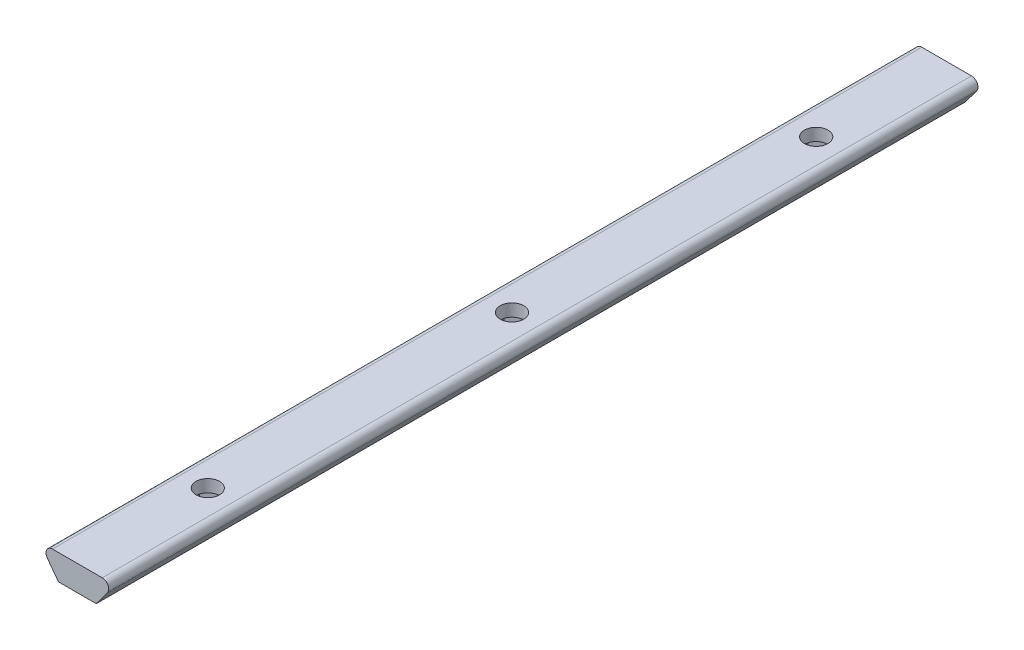
ISO-10303-21;
HEADER;
FILE_DESCRIPTION(('STEP AP214'),'2;1');
FILE_NAME('part.step','',(''),(''),'','','');
FILE_SCHEMA(('AUTOMOTIVE_DESIGN { 1 0 10303 214 1 1 1 1 }'));
ENDSEC;
DATA;
#1=APPLICATION_CONTEXT('core data for automotive mechanical design processes');
#2=APPLICATION_PROTOCOL_DEFINITION('international standard','automotive_design',2000,#1);
#3=PRODUCT_CONTEXT('',#1,'mechanical');
#4=PRODUCT('Part','Part','',(#3));
#5=PRODUCT_RELATED_PRODUCT_CATEGORY('part','',(#4));
#6=PRODUCT_DEFINITION_FORMATION('','',#4);
#7=PRODUCT_DEFINITION_CONTEXT('part definition',#1,'design');
#8=PRODUCT_DEFINITION('design','',#6,#7);
#9=PRODUCT_DEFINITION_SHAPE('','',#8);
#10=(LENGTH_UNIT() NAMED_UNIT(*) SI_UNIT(.MILLI.,.METRE.));
#11=(NAMED_UNIT(*) PLANE_ANGLE_UNIT() SI_UNIT($,.RADIAN.));
#12=(NAMED_UNIT(*) SI_UNIT($,.STERADIAN.) SOLID_ANGLE_UNIT());
#13=UNCERTAINTY_MEASURE_WITH_UNIT(LENGTH_MEASURE(1.E-05),#10,'distance_accuracy_value','');
#14=(GEOMETRIC_REPRESENTATION_CONTEXT(3) GLOBAL_UNCERTAINTY_ASSIGNED_CONTEXT((#13)) GLOBAL_UNIT_ASSIGNED_CONTEXT((#10,
#11,#12)) REPRESENTATION_CONTEXT('',''));
#15=CARTESIAN_POINT('',(0.,0.,0.));
#16=DIRECTION('',(0.,0.,1.));
#17=DIRECTION('',(1.,0.,0.));
#18=AXIS2_PLACEMENT_3D('',#15,#16,#17);
#19=CARTESIAN_POINT('',(0.,0.,133.3));
#20=DIRECTION('',(0.,1.,0.));
#21=DIRECTION('',(0.,0.,1.));
#22=AXIS2_PLACEMENT_3D('',#19,#20,#21);
#23=PLANE('',#22);
#24=DIRECTION('',(0.,0.,-1.));
#25=VECTOR('',#24,1.);
#26=CARTESIAN_POINT('',(0.,0.,133.3));
#27=LINE('',#26,#25);
#28=CARTESIAN_POINT('',(0.,0.,111.639934190753));
#29=VERTEX_POINT('',#28);
#30=CARTESIAN_POINT('',(0.,0.,66.6607102671154));
#31=VERTEX_POINT('',#30);
#32=EDGE_CURVE('E436',#29,#31,#27,.T.);
#33=ORIENTED_EDGE('',*,*,#32,.T.);
#34=DIRECTION('',(-0.00738629036714074,0.,-0.999972720985234));
#35=VECTOR('',#34,1.);
#36=CARTESIAN_POINT('',(0.0124460916649857,0.,68.3456903490297));
#37=LINE('',#36,#35);
#38=CARTESIAN_POINT('',(0.0124460916649857,0.,68.3456903490297));
#39=VERTEX_POINT('',#38);
#40=EDGE_CURVE('E256',#39,#31,#37,.T.);
#41=ORIENTED_EDGE('',*,*,#40,.F.);
#42=DIRECTION('',(-0.869694924648231,0.,-0.493589645394945));
#43=VECTOR('',#42,1.);
#44=CARTESIAN_POINT('',(2.92473396504435,0.,69.99854021393));
#45=LINE('',#44,#43);
#46=CARTESIAN_POINT('',(2.92473396504435,0.,69.99854021393));
#47=VERTEX_POINT('',#46);
#48=EDGE_CURVE('E271',#47,#39,#45,.T.);
#49=ORIENTED_EDGE('',*,*,#48,.F.);
#50=DIRECTION('',(-0.862308634281092,0.,0.506383075590287));
#51=VECTOR('',#50,1.);
#52=CARTESIAN_POINT('',(5.81228787337934,0.,68.3028498649003));
#53=LINE('',#52,#51);
#54=CARTESIAN_POINT('',(5.79999999999999,0.,68.3100658092466));
#55=VERTEX_POINT('',#54);
#56=EDGE_CURVE('E269',#55,#47,#53,.T.);
#57=ORIENTED_EDGE('',*,*,#56,.F.);
#58=DIRECTION('',(0.,0.,-1.));
#59=VECTOR('',#58,1.);
#60=CARTESIAN_POINT('',(5.8,0.,133.3));
#61=LINE('',#60,#59);
#62=CARTESIAN_POINT('',(5.8,0.,113.289289733012));
#63=VERTEX_POINT('',#62);
#64=EDGE_CURVE('E431',#63,#55,#61,.T.);
#65=ORIENTED_EDGE('',*,*,#64,.F.);
#66=DIRECTION('',(0.00738629036714048,0.,0.999972720985234));
#67=VECTOR('',#66,1.);
#68=CARTESIAN_POINT('',(5.78755390833501,0.,111.60430965097));
#69=LINE('',#68,#67);
#70=CARTESIAN_POINT('',(5.78755390833501,0.,111.60430965097));
#71=VERTEX_POINT('',#70);
#72=EDGE_CURVE('E370',#71,#63,#69,.T.);
#73=ORIENTED_EDGE('',*,*,#72,.F.);
#74=DIRECTION('',(0.869694924648232,0.,0.493589645394945));
#75=VECTOR('',#74,1.);
#76=CARTESIAN_POINT('',(2.87526603495567,0.,109.95145978607));
#77=LINE('',#76,#75);
#78=CARTESIAN_POINT('',(2.87526603495567,0.,109.95145978607));
#79=VERTEX_POINT('',#78);
#80=EDGE_CURVE('E367',#79,#71,#77,.T.);
#81=ORIENTED_EDGE('',*,*,#80,.F.);
#82=DIRECTION('',(0.86230863428109,0.,-0.506383075590289));
#83=VECTOR('',#82,1.);
#84=CARTESIAN_POINT('',(-0.0122878733793465,0.,111.6471501351));
#85=LINE('',#84,#83);
#86=EDGE_CURVE('E351',#29,#79,#85,.T.);
#87=ORIENTED_EDGE('',*,*,#86,.F.);
#88=EDGE_LOOP('',(#33,#41,#49,#57,#65,#73,#81,#87));
#89=FACE_BOUND('',#88,.T.);
#90=ADVANCED_FACE('F32',(#89),#23,.F.);
#91=DIRECTION('',(0.869694924648232,0.,0.493589645394945));
#92=VECTOR('',#91,1.);
#93=CARTESIAN_POINT('',(2.87526603495567,0.,63.30145978607));
#94=LINE('',#93,#92);
#95=CARTESIAN_POINT('',(2.87526603495567,0.,63.30145978607));
#96=VERTEX_POINT('',#95);
#97=CARTESIAN_POINT('',(5.78755390833501,0.,64.9543096509703));
#98=VERTEX_POINT('',#97);
#99=EDGE_CURVE('E237',#96,#98,#94,.T.);
#100=ORIENTED_EDGE('',*,*,#99,.F.);
#101=DIRECTION('',(0.86230863428109,0.,-0.506383075590289));
#102=VECTOR('',#101,1.);
#103=CARTESIAN_POINT('',(-0.0122878733793465,0.,64.9971501350997));
#104=LINE('',#103,#102);
#105=CARTESIAN_POINT('',(0.,0.,64.9899341907534));
#106=VERTEX_POINT('',#105);
#107=EDGE_CURVE('E254',#106,#96,#104,.T.);
#108=ORIENTED_EDGE('',*,*,#107,.F.);
#109=CARTESIAN_POINT('',(0.,0.,20.0107102671154));
#110=VERTEX_POINT('',#109);
#111=EDGE_CURVE('E552',#106,#110,#27,.T.);
#112=ORIENTED_EDGE('',*,*,#111,.T.);
#113=DIRECTION('',(-0.00738629036714074,0.,-0.999972720985234));
#114=VECTOR('',#113,1.);
#115=CARTESIAN_POINT('',(0.0124460916649857,0.,21.6956903490297));
#116=LINE('',#115,#114);
#117=CARTESIAN_POINT('',(0.0124460916649857,0.,21.6956903490297));
#118=VERTEX_POINT('',#117);
#119=EDGE_CURVE('E316',#118,#110,#116,.T.);
#120=ORIENTED_EDGE('',*,*,#119,.F.);
#121=DIRECTION('',(-0.869694924648231,0.,-0.493589645394945));
#122=VECTOR('',#121,1.);
#123=CARTESIAN_POINT('',(2.92473396504435,0.,23.34854021393));
#124=LINE('',#123,#122);
#125=CARTESIAN_POINT('',(2.92473396504435,0.,23.34854021393));
#126=VERTEX_POINT('',#125);
#127=EDGE_CURVE('E313',#126,#118,#124,.T.);
#128=ORIENTED_EDGE('',*,*,#127,.F.);
#129=DIRECTION('',(-0.862308634281092,0.,0.506383075590287));
#130=VECTOR('',#129,1.);
#131=CARTESIAN_POINT('',(5.81228787337934,0.,21.6528498649003));
#132=LINE('',#131,#130);
#133=CARTESIAN_POINT('',(5.79999999999999,0.,21.6600658092466));
#134=VERTEX_POINT('',#133);
#135=EDGE_CURVE('E311',#134,#126,#132,.T.);
#136=ORIENTED_EDGE('',*,*,#135,.F.);
#137=CARTESIAN_POINT('',(5.8,0.,66.6392897332023));
#138=VERTEX_POINT('',#137);
#139=EDGE_CURVE('E481',#138,#134,#61,.T.);
#140=ORIENTED_EDGE('',*,*,#139,.F.);
#141=DIRECTION('',(0.00738629036714048,0.,0.999972720985234));
#142=VECTOR('',#141,1.);
#143=CARTESIAN_POINT('',(5.78755390833501,0.,64.9543096509703));
#144=LINE('',#143,#142);
#145=EDGE_CURVE('E55',#98,#138,#144,.T.);
#146=ORIENTED_EDGE('',*,*,#145,.F.);
#147=EDGE_LOOP('',(#100,#108,#112,#120,#128,#136,#140,#146));
#148=FACE_BOUND('',#147,.T.);
#149=ADVANCED_FACE('F484',(#148),#23,.F.);
#150=CARTESIAN_POINT('',(2.9,200.,20.));
#151=DIRECTION('',(0.,-1.,0.));
#152=DIRECTION('',(0.,0.,-1.));
#153=AXIS2_PLACEMENT_3D('',#150,#151,#152);
#154=CYLINDRICAL_SURFACE('',#153,1.8);
#155=CARTESIAN_POINT('',(2.9,3.89999999999999,20.));
#156=DIRECTION('',(0.,-1.,0.));
#157=DIRECTION('',(0.,0.,-1.));
#158=AXIS2_PLACEMENT_3D('',#155,#156,#157);
#159=CIRCLE('',#158,1.8);
#160=CARTESIAN_POINT('',(2.9,3.89999999999999,18.2));
#161=VERTEX_POINT('',#160);
#162=EDGE_CURVE('E346',#161,#161,#159,.T.);
#163=ORIENTED_EDGE('',*,*,#162,.F.);
#164=EDGE_LOOP('',(#163));
#165=FACE_BOUND('',#164,.T.);
#166=CARTESIAN_POINT('',(2.9,2.,20.));
#167=DIRECTION('',(0.,-1.,0.));
#168=DIRECTION('',(0.,0.,-1.));
#169=AXIS2_PLACEMENT_3D('',#166,#167,#168);
#170=CIRCLE('',#169,1.8);
#171=CARTESIAN_POINT('',(2.9,2.,18.2));
#172=VERTEX_POINT('',#171);
#173=EDGE_CURVE('E337',#172,#172,#170,.F.);
#174=ORIENTED_EDGE('',*,*,#173,.F.);
#175=EDGE_LOOP('',(#174));
#176=FACE_BOUND('',#175,.T.);
#177=ADVANCED_FACE('F570',(#165,#176),#154,.F.);
#178=CARTESIAN_POINT('',(2.9,200.,66.65));
#179=DIRECTION('',(0.,-1.,0.));
#180=DIRECTION('',(0.,0.,-1.));
#181=AXIS2_PLACEMENT_3D('',#178,#179,#180);
#182=CYLINDRICAL_SURFACE('',#181,1.8);
#183=CARTESIAN_POINT('',(2.9,3.89999999999999,66.65));
#184=DIRECTION('',(0.,-1.,0.));
#185=DIRECTION('',(0.,0.,-1.));
#186=AXIS2_PLACEMENT_3D('',#183,#184,#185);
#187=CIRCLE('',#186,1.8);
#188=CARTESIAN_POINT('',(2.9,3.89999999999999,64.85));
#189=VERTEX_POINT('',#188);
#190=EDGE_CURVE('E371',#189,#189,#187,.T.);
#191=ORIENTED_EDGE('',*,*,#190,.F.);
#192=EDGE_LOOP('',(#191));
#193=FACE_BOUND('',#192,.T.);
#194=CARTESIAN_POINT('',(2.9,2.,66.65));
#195=DIRECTION('',(0.,-1.,0.));
#196=DIRECTION('',(0.,0.,-1.));
#197=AXIS2_PLACEMENT_3D('',#194,#195,#196);
#198=CIRCLE('',#197,1.8);
#199=CARTESIAN_POINT('',(2.9,2.,64.85));
#200=VERTEX_POINT('',#199);
#201=EDGE_CURVE('E277',#200,#200,#198,.F.);
#202=ORIENTED_EDGE('',*,*,#201,.F.);
#203=EDGE_LOOP('',(#202));
#204=FACE_BOUND('',#203,.T.);
#205=ADVANCED_FACE('F580',(#193,#204),#182,.F.);
#206=CARTESIAN_POINT('',(0.,0.,133.3));
#207=VERTEX_POINT('',#206);
#208=CARTESIAN_POINT('',(0.,0.,113.310710267115));
#209=VERTEX_POINT('',#208);
#210=EDGE_CURVE('E432',#207,#209,#27,.T.);
#211=ORIENTED_EDGE('',*,*,#210,.T.);
#212=DIRECTION('',(-0.00738629036714074,0.,-0.999972720985234));
#213=VECTOR('',#212,1.);
#214=CARTESIAN_POINT('',(0.0124460916649857,0.,114.99569034903));
#215=LINE('',#214,#213);
#216=CARTESIAN_POINT('',(0.0124460916649857,0.,114.99569034903));
#217=VERTEX_POINT('',#216);
#218=EDGE_CURVE('E378',#217,#209,#215,.T.);
#219=ORIENTED_EDGE('',*,*,#218,.F.);
#220=DIRECTION('',(-0.869694924648231,0.,-0.493589645394945));
#221=VECTOR('',#220,1.);
#222=CARTESIAN_POINT('',(2.92473396504435,0.,116.64854021393));
#223=LINE('',#222,#221);
#224=CARTESIAN_POINT('',(2.92473396504435,0.,116.64854021393));
#225=VERTEX_POINT('',#224);
#226=EDGE_CURVE('E375',#225,#217,#223,.T.);
#227=ORIENTED_EDGE('',*,*,#226,.F.);
#228=DIRECTION('',(-0.862308634281092,0.,0.506383075590287));
#229=VECTOR('',#228,1.);
#230=CARTESIAN_POINT('',(5.81228787337934,0.,114.9528498649));
#231=LINE('',#230,#229);
#232=CARTESIAN_POINT('',(5.8,0.,114.960065809247));
#233=VERTEX_POINT('',#232);
#234=EDGE_CURVE('E373',#233,#225,#231,.T.);
#235=ORIENTED_EDGE('',*,*,#234,.F.);
#236=CARTESIAN_POINT('',(5.8,0.,133.3));
#237=VERTEX_POINT('',#236);
#238=EDGE_CURVE('E427',#237,#233,#61,.T.);
#239=ORIENTED_EDGE('',*,*,#238,.F.);
#240=DIRECTION('',(1.,0.,0.));
#241=VECTOR('',#240,1.);
#242=CARTESIAN_POINT('',(0.,0.,133.3));
#243=LINE('',#242,#241);
#244=EDGE_CURVE('E406',#207,#237,#243,.T.);
#245=ORIENTED_EDGE('',*,*,#244,.F.);
#246=EDGE_LOOP('',(#211,#219,#227,#235,#239,#245));
#247=FACE_BOUND('',#246,.T.);
#248=ADVANCED_FACE('F520',(#247),#23,.F.);
#249=CARTESIAN_POINT('',(2.9,200.,113.3));
#250=DIRECTION('',(0.,-1.,0.));
#251=DIRECTION('',(0.,0.,-1.));
#252=AXIS2_PLACEMENT_3D('',#249,#250,#251);
#253=CYLINDRICAL_SURFACE('',#252,1.8);
#254=CARTESIAN_POINT('',(2.9,3.89999999999999,113.3));
#255=DIRECTION('',(0.,-1.,0.));
#256=DIRECTION('',(0.,0.,-1.));
#257=AXIS2_PLACEMENT_3D('',#254,#255,#256);
#258=CIRCLE('',#257,1.8);
#259=CARTESIAN_POINT('',(2.9,3.89999999999999,111.5));
#260=VERTEX_POINT('',#259);
#261=EDGE_CURVE('E403',#260,#260,#258,.T.);
#262=ORIENTED_EDGE('',*,*,#261,.F.);
#263=EDGE_LOOP('',(#262));
#264=FACE_BOUND('',#263,.T.);
#265=CARTESIAN_POINT('',(2.9,2.,113.3));
#266=DIRECTION('',(0.,-1.,0.));
#267=DIRECTION('',(0.,0.,-1.));
#268=AXIS2_PLACEMENT_3D('',#265,#266,#267);
#269=CIRCLE('',#268,1.8);
#270=CARTESIAN_POINT('',(2.9,2.,111.5));
#271=VERTEX_POINT('',#270);
#272=EDGE_CURVE('E384',#271,#271,#269,.F.);
#273=ORIENTED_EDGE('',*,*,#272,.F.);
#274=EDGE_LOOP('',(#273));
#275=FACE_BOUND('',#274,.T.);
#276=ADVANCED_FACE('F578',(#264,#275),#253,.F.);
#277=CARTESIAN_POINT('',(0.,0.,133.3));
#278=DIRECTION('',(0.802462340946133,0.596702766344561,0.));
#279=DIRECTION('',(-0.596702766344561,0.802462340946133,0.));
#280=AXIS2_PLACEMENT_3D('',#277,#278,#279);
#281=PLANE('',#280);
#282=ORIENTED_EDGE('',*,*,#111,.F.);
#283=DIRECTION('',(-0.563131146855575,0.757314300943704,0.330693757164048));
#284=VECTOR('',#283,1.);
#285=CARTESIAN_POINT('',(-12.7209706028487,17.1075121900379,72.4602110293179));
#286=LINE('',#285,#284);
#287=CARTESIAN_POINT('',(-0.0122878733793465,0.0165250710963627,64.9971501350997));
#288=VERTEX_POINT('',#287);
#289=EDGE_CURVE('E343',#106,#288,#286,.T.);
#290=ORIENTED_EDGE('',*,*,#289,.T.);
#291=DIRECTION('',(0.00738592599076273,-0.00993279702206022,0.999923390885811));
#292=VECTOR('',#291,1.);
#293=CARTESIAN_POINT('',(0.492155155584909,-0.661863829924532,133.28979003719));
#294=LINE('',#293,#292);
#295=EDGE_CURVE('E340',#288,#31,#294,.T.);
#296=ORIENTED_EDGE('',*,*,#295,.T.);
#297=ORIENTED_EDGE('',*,*,#32,.F.);
#298=DIRECTION('',(-0.563131146855575,0.757314300943704,0.330693757164048));
#299=VECTOR('',#298,1.);
#300=CARTESIAN_POINT('',(-4.03362311470496,5.42452763701702,114.008643487396));
#301=LINE('',#300,#299);
#302=CARTESIAN_POINT('',(-0.0122878733793465,0.0165250710963625,111.6471501351));
#303=VERTEX_POINT('',#302);
#304=EDGE_CURVE('E400',#29,#303,#301,.T.);
#305=ORIENTED_EDGE('',*,*,#304,.T.);
#306=DIRECTION('',(0.00738592599076273,-0.00993279702206022,0.999923390885811));
#307=VECTOR('',#306,1.);
#308=CARTESIAN_POINT('',(0.147628104050229,-0.19853434682617,133.296937393757));
#309=LINE('',#308,#307);
#310=EDGE_CURVE('E397',#303,#209,#309,.T.);
#311=ORIENTED_EDGE('',*,*,#310,.T.);
#312=ORIENTED_EDGE('',*,*,#210,.F.);
#313=DIRECTION('',(0.596702766344561,-0.802462340946133,0.));
#314=VECTOR('',#313,1.);
#315=CARTESIAN_POINT('',(0.,0.,133.3));
#316=LINE('',#315,#314);
#317=CARTESIAN_POINT('',(-1.71270819938481,2.30329723365544,133.3));
#318=VERTEX_POINT('',#317);
#319=EDGE_CURVE('E404',#318,#207,#316,.T.);
#320=ORIENTED_EDGE('',*,*,#319,.F.);
#321=DIRECTION('',(0.,0.,-1.));
#322=VECTOR('',#321,1.);
#323=CARTESIAN_POINT('',(-1.71270819938481,2.30329723365544,133.3));
#324=LINE('',#323,#322);
#325=CARTESIAN_POINT('',(-1.71270819938481,2.30329723365544,0.));
#326=VERTEX_POINT('',#325);
#327=EDGE_CURVE('E435',#318,#326,#324,.T.);
#328=ORIENTED_EDGE('',*,*,#327,.T.);
#329=DIRECTION('',(0.596702766344561,-0.802462340946133,0.));
#330=VECTOR('',#329,1.);
#331=CARTESIAN_POINT('',(0.,0.,0.));
#332=LINE('',#331,#330);
#333=CARTESIAN_POINT('',(0.,0.,0.));
#334=VERTEX_POINT('',#333);
#335=EDGE_CURVE('E416',#326,#334,#332,.T.);
#336=ORIENTED_EDGE('',*,*,#335,.T.);
#337=CARTESIAN_POINT('',(0.,0.,18.3399341907534));
#338=VERTEX_POINT('',#337);
#339=EDGE_CURVE('E430',#338,#334,#27,.T.);
#340=ORIENTED_EDGE('',*,*,#339,.F.);
#341=DIRECTION('',(-0.563131146855575,0.757314300943704,0.330693757164048));
#342=VECTOR('',#341,1.);
#343=CARTESIAN_POINT('',(-21.4083180909924,28.7904967430588,30.9117785712402));
#344=LINE('',#343,#342);
#345=CARTESIAN_POINT('',(-0.0122878733793464,0.0165250710963623,18.3471501350997));
#346=VERTEX_POINT('',#345);
#347=EDGE_CURVE('E336',#338,#346,#344,.T.);
#348=ORIENTED_EDGE('',*,*,#347,.T.);
#349=DIRECTION('',(0.00738592599076273,-0.00993279702206022,0.999923390885811));
#350=VECTOR('',#349,1.);
#351=CARTESIAN_POINT('',(0.836682207119588,-1.12519331302289,133.282642680623));
#352=LINE('',#351,#350);
#353=EDGE_CURVE('E333',#346,#110,#352,.T.);
#354=ORIENTED_EDGE('',*,*,#353,.T.);
#355=EDGE_LOOP('',(#282,#290,#296,#297,#305,#311,#312,#320,#328,#336,#340,#348,#354));
#356=FACE_BOUND('',#355,.T.);
#357=ADVANCED_FACE('F515',(#356),#281,.F.);
#358=DIRECTION('',(0.869694924648232,0.,0.493589645394945));
#359=VECTOR('',#358,1.);
#360=CARTESIAN_POINT('',(2.87526603495567,0.,16.65145978607));
#361=LINE('',#360,#359);
#362=CARTESIAN_POINT('',(2.87526603495567,0.,16.65145978607));
#363=VERTEX_POINT('',#362);
#364=CARTESIAN_POINT('',(5.78755390833501,0.,18.3043096509703));
#365=VERTEX_POINT('',#364);
#366=EDGE_CURVE('E307',#363,#365,#361,.T.);
#367=ORIENTED_EDGE('',*,*,#366,.F.);
#368=DIRECTION('',(0.86230863428109,0.,-0.506383075590289));
#369=VECTOR('',#368,1.);
#370=CARTESIAN_POINT('',(-0.0122878733793465,0.,18.3471501350997));
#371=LINE('',#370,#369);
#372=EDGE_CURVE('E291',#338,#363,#371,.T.);
#373=ORIENTED_EDGE('',*,*,#372,.F.);
#374=ORIENTED_EDGE('',*,*,#339,.T.);
#375=DIRECTION('',(1.,0.,0.));
#376=VECTOR('',#375,1.);
#377=CARTESIAN_POINT('',(0.,0.,0.));
#378=LINE('',#377,#376);
#379=CARTESIAN_POINT('',(5.8,0.,0.));
#380=VERTEX_POINT('',#379);
#381=EDGE_CURVE('E419',#334,#380,#378,.T.);
#382=ORIENTED_EDGE('',*,*,#381,.T.);
#383=CARTESIAN_POINT('',(5.8,0.,19.9892897334566));
#384=VERTEX_POINT('',#383);
#385=EDGE_CURVE('E415',#384,#380,#61,.T.);
#386=ORIENTED_EDGE('',*,*,#385,.F.);
#387=DIRECTION('',(0.00738629036714048,0.,0.999972720985234));
#388=VECTOR('',#387,1.);
#389=CARTESIAN_POINT('',(5.78755390833501,0.,18.3043096509703));
#390=LINE('',#389,#388);
#391=EDGE_CURVE('E47',#365,#384,#390,.T.);
#392=ORIENTED_EDGE('',*,*,#391,.F.);
#393=EDGE_LOOP('',(#367,#373,#374,#382,#386,#392));
#394=FACE_BOUND('',#393,.T.);
#395=ADVANCED_FACE('F492',(#394),#23,.F.);
#396=CARTESIAN_POINT('',(5.8,0.,133.3));
#397=DIRECTION('',(-0.802462340946133,0.596702766344561,0.));
#398=DIRECTION('',(-0.596702766344561,-0.802462340946134,0.));
#399=AXIS2_PLACEMENT_3D('',#396,#397,#398);
#400=PLANE('',#399);
#401=ORIENTED_EDGE('',*,*,#64,.T.);
#402=DIRECTION('',(0.563131146855575,0.757314300943705,-0.330693757164046));
#403=VECTOR('',#402,1.);
#404=CARTESIAN_POINT('',(-6.30268256262948,-16.2760213773293,75.4172584956177));
#405=LINE('',#404,#403);
#406=CARTESIAN_POINT('',(5.81228787337934,0.0165250710963549,68.3028498649003));
#407=VERTEX_POINT('',#406);
#408=EDGE_CURVE('E11',#55,#407,#405,.T.);
#409=ORIENTED_EDGE('',*,*,#408,.T.);
#410=DIRECTION('',(-0.00738592599076247,-0.00993279702205988,-0.999923390885811));
#411=VECTOR('',#410,1.);
#412=CARTESIAN_POINT('',(6.29231335394503,0.662076579443321,133.289786755299));
#413=LINE('',#412,#411);
#414=EDGE_CURVE('E40',#407,#138,#413,.T.);
#415=ORIENTED_EDGE('',*,*,#414,.T.);
#416=ORIENTED_EDGE('',*,*,#139,.T.);
#417=DIRECTION('',(0.563131146855575,0.757314300943705,-0.330693757164046));
#418=VECTOR('',#417,1.);
#419=CARTESIAN_POINT('',(-14.9900300507732,-27.9590059303501,33.86882603754));
#420=LINE('',#419,#418);
#421=CARTESIAN_POINT('',(5.81228787337934,0.0165250710963551,21.6528498649003));
#422=VERTEX_POINT('',#421);
#423=EDGE_CURVE('E474',#134,#422,#420,.T.);
#424=ORIENTED_EDGE('',*,*,#423,.T.);
#425=DIRECTION('',(-0.00738592599076247,-0.00993279702205988,-0.999923390885811));
#426=VECTOR('',#425,1.);
#427=CARTESIAN_POINT('',(6.6368404054797,1.12540606254167,133.282639398732));
#428=LINE('',#427,#426);
#429=EDGE_CURVE('E464',#422,#384,#428,.T.);
#430=ORIENTED_EDGE('',*,*,#429,.T.);
#431=ORIENTED_EDGE('',*,*,#385,.T.);
#432=DIRECTION('',(0.596702766344561,0.802462340946133,0.));
#433=VECTOR('',#432,1.);
#434=CARTESIAN_POINT('',(5.8,0.,0.));
#435=LINE('',#434,#433);
#436=CARTESIAN_POINT('',(7.51270819938481,2.30329723365544,0.));
#437=VERTEX_POINT('',#436);
#438=EDGE_CURVE('E422',#380,#437,#435,.T.);
#439=ORIENTED_EDGE('',*,*,#438,.T.);
#440=DIRECTION('',(0.,0.,-1.));
#441=VECTOR('',#440,1.);
#442=CARTESIAN_POINT('',(7.51270819938481,2.30329723365544,133.3));
#443=LINE('',#442,#441);
#444=CARTESIAN_POINT('',(7.51270819938481,2.30329723365544,133.3));
#445=VERTEX_POINT('',#444);
#446=EDGE_CURVE('E452',#437,#445,#443,.F.);
#447=ORIENTED_EDGE('',*,*,#446,.T.);
#448=DIRECTION('',(0.596702766344561,0.802462340946133,0.));
#449=VECTOR('',#448,1.);
#450=CARTESIAN_POINT('',(5.8,0.,133.3));
#451=LINE('',#450,#449);
#452=EDGE_CURVE('E409',#237,#445,#451,.T.);
#453=ORIENTED_EDGE('',*,*,#452,.F.);
#454=ORIENTED_EDGE('',*,*,#238,.T.);
#455=DIRECTION('',(0.563131146855575,0.757314300943705,-0.330693757164046));
#456=VECTOR('',#455,1.);
#457=CARTESIAN_POINT('',(2.38466492551421,-4.59303682430848,116.965690953695));
#458=LINE('',#457,#456);
#459=CARTESIAN_POINT('',(5.81228787337934,0.0165250710963549,114.9528498649));
#460=VERTEX_POINT('',#459);
#461=EDGE_CURVE('E461',#233,#460,#458,.T.);
#462=ORIENTED_EDGE('',*,*,#461,.T.);
#463=DIRECTION('',(-0.00738592599076247,-0.00993279702205988,-0.999923390885811));
#464=VECTOR('',#463,1.);
#465=CARTESIAN_POINT('',(5.94778630241036,0.198747096344974,133.296934111866));
#466=LINE('',#465,#464);
#467=EDGE_CURVE('E454',#460,#63,#466,.T.);
#468=ORIENTED_EDGE('',*,*,#467,.T.);
#469=EDGE_LOOP('',(#401,#409,#415,#416,#424,#430,#431,#439,#447,#453,#454,#462,#468));
#470=FACE_BOUND('',#469,.T.);
#471=ADVANCED_FACE('F480',(#470),#400,.F.);
#472=CARTESIAN_POINT('',(-2.9,3.9,133.3));
#473=DIRECTION('',(0.,-1.,0.));
#474=DIRECTION('',(0.,0.,-1.));
#475=AXIS2_PLACEMENT_3D('',#472,#473,#474);
#476=PLANE('',#475);
#477=ORIENTED_EDGE('',*,*,#190,.T.);
#478=EDGE_LOOP('',(#477));
#479=FACE_BOUND('',#478,.T.);
#480=ORIENTED_EDGE('',*,*,#162,.T.);
#481=EDGE_LOOP('',(#480));
#482=FACE_BOUND('',#481,.T.);
#483=ORIENTED_EDGE('',*,*,#261,.T.);
#484=EDGE_LOOP('',(#483));
#485=FACE_BOUND('',#484,.T.);
#486=DIRECTION('',(-1.,0.,0.));
#487=VECTOR('',#486,1.);
#488=CARTESIAN_POINT('',(-2.9,3.9,0.));
#489=LINE('',#488,#487);
#490=CARTESIAN_POINT('',(6.71024585843868,3.9,0.));
#491=VERTEX_POINT('',#490);
#492=CARTESIAN_POINT('',(-0.91024585843868,3.9,0.));
#493=VERTEX_POINT('',#492);
#494=EDGE_CURVE('E407',#491,#493,#489,.T.);
#495=ORIENTED_EDGE('',*,*,#494,.T.);
#496=DIRECTION('',(0.,0.,-1.));
#497=VECTOR('',#496,1.);
#498=CARTESIAN_POINT('',(-0.91024585843868,3.9,133.3));
#499=LINE('',#498,#497);
#500=CARTESIAN_POINT('',(-0.91024585843868,3.9,133.3));
#501=VERTEX_POINT('',#500);
#502=EDGE_CURVE('E446',#493,#501,#499,.F.);
#503=ORIENTED_EDGE('',*,*,#502,.T.);
#504=DIRECTION('',(-1.,0.,0.));
#505=VECTOR('',#504,1.);
#506=CARTESIAN_POINT('',(-2.9,3.9,133.3));
#507=LINE('',#506,#505);
#508=CARTESIAN_POINT('',(6.71024585843868,3.9,133.3));
#509=VERTEX_POINT('',#508);
#510=EDGE_CURVE('E412',#509,#501,#507,.T.);
#511=ORIENTED_EDGE('',*,*,#510,.F.);
#512=DIRECTION('',(0.,0.,-1.));
#513=VECTOR('',#512,1.);
#514=CARTESIAN_POINT('',(6.71024585843868,3.9,133.3));
#515=LINE('',#514,#513);
#516=EDGE_CURVE('E443',#509,#491,#515,.T.);
#517=ORIENTED_EDGE('',*,*,#516,.T.);
#518=EDGE_LOOP('',(#495,#503,#511,#517));
#519=FACE_BOUND('',#518,.T.);
#520=ADVANCED_FACE('F504',(#479,#482,#485,#519),#476,.F.);
#521=CARTESIAN_POINT('',(0.,0.,133.3));
#522=DIRECTION('',(0.,0.,-1.));
#523=DIRECTION('',(-1.,0.,0.));
#524=AXIS2_PLACEMENT_3D('',#521,#522,#523);
#525=PLANE('',#524);
#526=ORIENTED_EDGE('',*,*,#510,.T.);
#527=CARTESIAN_POINT('',(-0.91024585843868,2.9,133.3));
#528=DIRECTION('',(0.,0.,-1.));
#529=DIRECTION('',(-1.,0.,0.));
#530=AXIS2_PLACEMENT_3D('',#527,#528,#529);
#531=CIRCLE('',#530,1.);
#532=EDGE_CURVE('E450',#501,#318,#531,.F.);
#533=ORIENTED_EDGE('',*,*,#532,.T.);
#534=ORIENTED_EDGE('',*,*,#319,.T.);
#535=ORIENTED_EDGE('',*,*,#244,.T.);
#536=ORIENTED_EDGE('',*,*,#452,.T.);
#537=CARTESIAN_POINT('',(6.71024585843868,2.9,133.3));
#538=DIRECTION('',(0.,0.,-1.));
#539=DIRECTION('',(-1.,0.,0.));
#540=AXIS2_PLACEMENT_3D('',#537,#538,#539);
#541=CIRCLE('',#540,1.);
#542=EDGE_CURVE('E448',#445,#509,#541,.F.);
#543=ORIENTED_EDGE('',*,*,#542,.T.);
#544=EDGE_LOOP('',(#526,#533,#534,#535,#536,#543));
#545=FACE_BOUND('',#544,.T.);
#546=ADVANCED_FACE('F508',(#545),#525,.F.);
#547=CARTESIAN_POINT('',(0.,0.,0.));
#548=DIRECTION('',(0.,0.,-1.));
#549=DIRECTION('',(-1.,0.,0.));
#550=AXIS2_PLACEMENT_3D('',#547,#548,#549);
#551=PLANE('',#550);
#552=ORIENTED_EDGE('',*,*,#335,.F.);
#553=CARTESIAN_POINT('',(-0.91024585843868,2.9,0.));
#554=DIRECTION('',(0.,0.,-1.));
#555=DIRECTION('',(-1.,0.,0.));
#556=AXIS2_PLACEMENT_3D('',#553,#554,#555);
#557=CIRCLE('',#556,1.);
#558=EDGE_CURVE('E441',#326,#493,#557,.T.);
#559=ORIENTED_EDGE('',*,*,#558,.T.);
#560=ORIENTED_EDGE('',*,*,#494,.F.);
#561=CARTESIAN_POINT('',(6.71024585843868,2.9,0.));
#562=DIRECTION('',(0.,0.,-1.));
#563=DIRECTION('',(-1.,0.,0.));
#564=AXIS2_PLACEMENT_3D('',#561,#562,#563);
#565=CIRCLE('',#564,1.);
#566=EDGE_CURVE('E439',#491,#437,#565,.T.);
#567=ORIENTED_EDGE('',*,*,#566,.T.);
#568=ORIENTED_EDGE('',*,*,#438,.F.);
#569=ORIENTED_EDGE('',*,*,#381,.F.);
#570=EDGE_LOOP('',(#552,#559,#560,#567,#568,#569));
#571=FACE_BOUND('',#570,.T.);
#572=ADVANCED_FACE('F497',(#571),#551,.T.);
#573=CARTESIAN_POINT('',(-0.91024585843868,2.9,133.3));
#574=DIRECTION('',(0.,0.,-1.));
#575=DIRECTION('',(-1.,0.,0.));
#576=AXIS2_PLACEMENT_3D('',#573,#574,#575);
#577=CYLINDRICAL_SURFACE('',#576,1.);
#578=ORIENTED_EDGE('',*,*,#532,.F.);
#579=ORIENTED_EDGE('',*,*,#502,.F.);
#580=ORIENTED_EDGE('',*,*,#558,.F.);
#581=ORIENTED_EDGE('',*,*,#327,.F.);
#582=EDGE_LOOP('',(#578,#579,#580,#581));
#583=FACE_BOUND('',#582,.T.);
#584=ADVANCED_FACE('F512',(#583),#577,.T.);
#585=CARTESIAN_POINT('',(6.71024585843868,2.9,133.3));
#586=DIRECTION('',(0.,0.,-1.));
#587=DIRECTION('',(-1.,0.,0.));
#588=AXIS2_PLACEMENT_3D('',#585,#586,#587);
#589=CYLINDRICAL_SURFACE('',#588,1.);
#590=ORIENTED_EDGE('',*,*,#542,.F.);
#591=ORIENTED_EDGE('',*,*,#446,.F.);
#592=ORIENTED_EDGE('',*,*,#566,.F.);
#593=ORIENTED_EDGE('',*,*,#516,.F.);
#594=EDGE_LOOP('',(#590,#591,#592,#593));
#595=FACE_BOUND('',#594,.T.);
#596=ADVANCED_FACE('F34',(#595),#589,.T.);
#597=CARTESIAN_POINT('',(-0.0122878733793465,2.,111.6471501351));
#598=DIRECTION('',(-0.506383075590289,0.,-0.86230863428109));
#599=DIRECTION('',(-0.86230863428109,0.,0.506383075590289));
#600=AXIS2_PLACEMENT_3D('',#597,#598,#599);
#601=PLANE('',#600);
#602=ORIENTED_EDGE('',*,*,#86,.T.);
#603=DIRECTION('',(0.,-1.,0.));
#604=VECTOR('',#603,1.);
#605=CARTESIAN_POINT('',(2.87526603495567,2.,109.95145978607));
#606=LINE('',#605,#604);
#607=CARTESIAN_POINT('',(2.87526603495567,2.,109.95145978607));
#608=VERTEX_POINT('',#607);
#609=EDGE_CURVE('E381',#608,#79,#606,.T.);
#610=ORIENTED_EDGE('',*,*,#609,.F.);
#611=DIRECTION('',(0.86230863428109,0.,-0.506383075590289));
#612=VECTOR('',#611,1.);
#613=CARTESIAN_POINT('',(-0.0122878733793465,2.,111.6471501351));
#614=LINE('',#613,#612);
#615=CARTESIAN_POINT('',(-0.0122878733793465,2.,111.6471501351));
#616=VERTEX_POINT('',#615);
#617=EDGE_CURVE('E363',#616,#608,#614,.T.);
#618=ORIENTED_EDGE('',*,*,#617,.F.);
#619=DIRECTION('',(0.,-1.,0.));
#620=VECTOR('',#619,1.);
#621=CARTESIAN_POINT('',(-0.0122878733793465,2.,111.6471501351));
#622=LINE('',#621,#620);
#623=EDGE_CURVE('E385',#616,#303,#622,.T.);
#624=ORIENTED_EDGE('',*,*,#623,.T.);
#625=ORIENTED_EDGE('',*,*,#304,.F.);
#626=EDGE_LOOP('',(#602,#610,#618,#624,#625));
#627=FACE_BOUND('',#626,.T.);
#628=ADVANCED_FACE('F605',(#627),#601,.F.);
#629=CARTESIAN_POINT('',(0.0124460916649857,2.,114.99569034903));
#630=DIRECTION('',(-0.999972720985234,0.,0.00738629036714074));
#631=DIRECTION('',(0.00738629036714074,0.,0.999972720985234));
#632=AXIS2_PLACEMENT_3D('',#629,#630,#631);
#633=PLANE('',#632);
#634=ORIENTED_EDGE('',*,*,#623,.F.);
#635=DIRECTION('',(-0.00738629036714074,0.,-0.999972720985234));
#636=VECTOR('',#635,1.);
#637=CARTESIAN_POINT('',(0.0124460916649857,2.,114.99569034903));
#638=LINE('',#637,#636);
#639=CARTESIAN_POINT('',(0.0124460916649857,2.,114.99569034903));
#640=VERTEX_POINT('',#639);
#641=EDGE_CURVE('E360',#640,#616,#638,.T.);
#642=ORIENTED_EDGE('',*,*,#641,.F.);
#643=DIRECTION('',(0.,-1.,0.));
#644=VECTOR('',#643,1.);
#645=CARTESIAN_POINT('',(0.0124460916649857,2.,114.99569034903));
#646=LINE('',#645,#644);
#647=EDGE_CURVE('E388',#640,#217,#646,.T.);
#648=ORIENTED_EDGE('',*,*,#647,.T.);
#649=ORIENTED_EDGE('',*,*,#218,.T.);
#650=ORIENTED_EDGE('',*,*,#310,.F.);
#651=EDGE_LOOP('',(#634,#642,#648,#649,#650));
#652=FACE_BOUND('',#651,.T.);
#653=ADVANCED_FACE('F608',(#652),#633,.F.);
#654=CARTESIAN_POINT('',(5.81228787337934,2.,114.9528498649));
#655=DIRECTION('',(0.506383075590287,0.,0.862308634281092));
#656=DIRECTION('',(0.862308634281092,0.,-0.506383075590287));
#657=AXIS2_PLACEMENT_3D('',#654,#655,#656);
#658=PLANE('',#657);
#659=ORIENTED_EDGE('',*,*,#234,.T.);
#660=DIRECTION('',(0.,-1.,0.));
#661=VECTOR('',#660,1.);
#662=CARTESIAN_POINT('',(2.92473396504435,2.,116.64854021393));
#663=LINE('',#662,#661);
#664=CARTESIAN_POINT('',(2.92473396504435,2.,116.64854021393));
#665=VERTEX_POINT('',#664);
#666=EDGE_CURVE('E390',#665,#225,#663,.T.);
#667=ORIENTED_EDGE('',*,*,#666,.F.);
#668=DIRECTION('',(-0.862308634281092,0.,0.506383075590287));
#669=VECTOR('',#668,1.);
#670=CARTESIAN_POINT('',(5.81228787337934,2.,114.9528498649));
#671=LINE('',#670,#669);
#672=CARTESIAN_POINT('',(5.81228787337934,2.,114.9528498649));
#673=VERTEX_POINT('',#672);
#674=EDGE_CURVE('E354',#673,#665,#671,.T.);
#675=ORIENTED_EDGE('',*,*,#674,.F.);
#676=DIRECTION('',(0.,-1.,0.));
#677=VECTOR('',#676,1.);
#678=CARTESIAN_POINT('',(5.81228787337934,2.,114.9528498649));
#679=LINE('',#678,#677);
#680=EDGE_CURVE('E393',#673,#460,#679,.T.);
#681=ORIENTED_EDGE('',*,*,#680,.T.);
#682=ORIENTED_EDGE('',*,*,#461,.F.);
#683=EDGE_LOOP('',(#659,#667,#675,#681,#682));
#684=FACE_BOUND('',#683,.T.);
#685=ADVANCED_FACE('F527',(#684),#658,.F.);
#686=CARTESIAN_POINT('',(5.78755390833501,2.,111.60430965097));
#687=DIRECTION('',(0.999972720985234,0.,-0.00738629036714049));
#688=DIRECTION('',(-0.00738629036714048,0.,-0.999972720985234));
#689=AXIS2_PLACEMENT_3D('',#686,#687,#688);
#690=PLANE('',#689);
#691=ORIENTED_EDGE('',*,*,#680,.F.);
#692=DIRECTION('',(0.00738629036714048,0.,0.999972720985234));
#693=VECTOR('',#692,1.);
#694=CARTESIAN_POINT('',(5.78755390833501,2.,111.60430965097));
#695=LINE('',#694,#693);
#696=CARTESIAN_POINT('',(5.78755390833501,2.,111.60430965097));
#697=VERTEX_POINT('',#696);
#698=EDGE_CURVE('E350',#697,#673,#695,.T.);
#699=ORIENTED_EDGE('',*,*,#698,.F.);
#700=DIRECTION('',(0.,-1.,0.));
#701=VECTOR('',#700,1.);
#702=CARTESIAN_POINT('',(5.78755390833501,2.,111.60430965097));
#703=LINE('',#702,#701);
#704=EDGE_CURVE('E366',#697,#71,#703,.T.);
#705=ORIENTED_EDGE('',*,*,#704,.T.);
#706=ORIENTED_EDGE('',*,*,#72,.T.);
#707=ORIENTED_EDGE('',*,*,#467,.F.);
#708=EDGE_LOOP('',(#691,#699,#705,#706,#707));
#709=FACE_BOUND('',#708,.T.);
#710=ADVANCED_FACE('F531',(#709),#690,.F.);
#711=CARTESIAN_POINT('',(0.,2.,0.));
#712=DIRECTION('',(0.,-1.,0.));
#713=DIRECTION('',(0.,0.,-1.));
#714=AXIS2_PLACEMENT_3D('',#711,#712,#713);
#715=PLANE('',#714);
#716=DIRECTION('',(0.869694924648232,0.,0.493589645394945));
#717=VECTOR('',#716,1.);
#718=CARTESIAN_POINT('',(2.87526603495567,2.,109.95145978607));
#719=LINE('',#718,#717);
#720=EDGE_CURVE('E347',#608,#697,#719,.T.);
#721=ORIENTED_EDGE('',*,*,#720,.T.);
#722=ORIENTED_EDGE('',*,*,#698,.T.);
#723=ORIENTED_EDGE('',*,*,#674,.T.);
#724=DIRECTION('',(-0.869694924648231,0.,-0.493589645394945));
#725=VECTOR('',#724,1.);
#726=CARTESIAN_POINT('',(2.92473396504435,2.,116.64854021393));
#727=LINE('',#726,#725);
#728=EDGE_CURVE('E357',#665,#640,#727,.T.);
#729=ORIENTED_EDGE('',*,*,#728,.T.);
#730=ORIENTED_EDGE('',*,*,#641,.T.);
#731=ORIENTED_EDGE('',*,*,#617,.T.);
#732=EDGE_LOOP('',(#721,#722,#723,#729,#730,#731));
#733=FACE_BOUND('',#732,.T.);
#734=ORIENTED_EDGE('',*,*,#272,.T.);
#735=EDGE_LOOP('',(#734));
#736=FACE_BOUND('',#735,.T.);
#737=ADVANCED_FACE('F600',(#733,#736),#715,.T.);
#738=CARTESIAN_POINT('',(2.87526603495567,2.,109.95145978607));
#739=DIRECTION('',(0.493589645394945,0.,-0.869694924648231));
#740=DIRECTION('',(-0.869694924648232,0.,-0.493589645394945));
#741=AXIS2_PLACEMENT_3D('',#738,#739,#740);
#742=PLANE('',#741);
#743=ORIENTED_EDGE('',*,*,#80,.T.);
#744=ORIENTED_EDGE('',*,*,#704,.F.);
#745=ORIENTED_EDGE('',*,*,#720,.F.);
#746=ORIENTED_EDGE('',*,*,#609,.T.);
#747=EDGE_LOOP('',(#743,#744,#745,#746));
#748=FACE_BOUND('',#747,.T.);
#749=ADVANCED_FACE('F603',(#748),#742,.F.);
#750=CARTESIAN_POINT('',(2.92473396504435,2.,116.64854021393));
#751=DIRECTION('',(-0.493589645394945,0.,0.869694924648231));
#752=DIRECTION('',(0.869694924648232,0.,0.493589645394945));
#753=AXIS2_PLACEMENT_3D('',#750,#751,#752);
#754=PLANE('',#753);
#755=ORIENTED_EDGE('',*,*,#226,.T.);
#756=ORIENTED_EDGE('',*,*,#647,.F.);
#757=ORIENTED_EDGE('',*,*,#728,.F.);
#758=ORIENTED_EDGE('',*,*,#666,.T.);
#759=EDGE_LOOP('',(#755,#756,#757,#758));
#760=FACE_BOUND('',#759,.T.);
#761=ADVANCED_FACE('F562',(#760),#754,.F.);
#762=CARTESIAN_POINT('',(-0.0122878733793465,2.,64.9971501350997));
#763=DIRECTION('',(-0.506383075590289,0.,-0.86230863428109));
#764=DIRECTION('',(-0.86230863428109,0.,0.506383075590289));
#765=AXIS2_PLACEMENT_3D('',#762,#763,#764);
#766=PLANE('',#765);
#767=ORIENTED_EDGE('',*,*,#107,.T.);
#768=DIRECTION('',(0.,-1.,0.));
#769=VECTOR('',#768,1.);
#770=CARTESIAN_POINT('',(2.87526603495567,2.,63.30145978607));
#771=LINE('',#770,#769);
#772=CARTESIAN_POINT('',(2.87526603495567,2.,63.30145978607));
#773=VERTEX_POINT('',#772);
#774=EDGE_CURVE('E275',#773,#96,#771,.T.);
#775=ORIENTED_EDGE('',*,*,#774,.F.);
#776=DIRECTION('',(0.86230863428109,0.,-0.506383075590289));
#777=VECTOR('',#776,1.);
#778=CARTESIAN_POINT('',(-0.0122878733793465,2.,64.9971501350997));
#779=LINE('',#778,#777);
#780=CARTESIAN_POINT('',(-0.0122878733793465,2.,64.9971501350997));
#781=VERTEX_POINT('',#780);
#782=EDGE_CURVE('E239',#781,#773,#779,.T.);
#783=ORIENTED_EDGE('',*,*,#782,.F.);
#784=DIRECTION('',(0.,-1.,0.));
#785=VECTOR('',#784,1.);
#786=CARTESIAN_POINT('',(-0.0122878733793465,2.,64.9971501350997));
#787=LINE('',#786,#785);
#788=EDGE_CURVE('E278',#781,#288,#787,.T.);
#789=ORIENTED_EDGE('',*,*,#788,.T.);
#790=ORIENTED_EDGE('',*,*,#289,.F.);
#791=EDGE_LOOP('',(#767,#775,#783,#789,#790));
#792=FACE_BOUND('',#791,.T.);
#793=ADVANCED_FACE('F548',(#792),#766,.F.);
#794=CARTESIAN_POINT('',(0.0124460916649857,2.,68.3456903490297));
#795=DIRECTION('',(-0.999972720985234,0.,0.00738629036714074));
#796=DIRECTION('',(0.00738629036714074,0.,0.999972720985234));
#797=AXIS2_PLACEMENT_3D('',#794,#795,#796);
#798=PLANE('',#797);
#799=ORIENTED_EDGE('',*,*,#788,.F.);
#800=DIRECTION('',(-0.00738629036714074,0.,-0.999972720985234));
#801=VECTOR('',#800,1.);
#802=CARTESIAN_POINT('',(0.0124460916649857,2.,68.3456903490297));
#803=LINE('',#802,#801);
#804=CARTESIAN_POINT('',(0.0124460916649857,2.,68.3456903490297));
#805=VERTEX_POINT('',#804);
#806=EDGE_CURVE('E263',#805,#781,#803,.T.);
#807=ORIENTED_EDGE('',*,*,#806,.F.);
#808=DIRECTION('',(0.,-1.,0.));
#809=VECTOR('',#808,1.);
#810=CARTESIAN_POINT('',(0.0124460916649857,2.,68.3456903490297));
#811=LINE('',#810,#809);
#812=EDGE_CURVE('E281',#805,#39,#811,.T.);
#813=ORIENTED_EDGE('',*,*,#812,.T.);
#814=ORIENTED_EDGE('',*,*,#40,.T.);
#815=ORIENTED_EDGE('',*,*,#295,.F.);
#816=EDGE_LOOP('',(#799,#807,#813,#814,#815));
#817=FACE_BOUND('',#816,.T.);
#818=ADVANCED_FACE('F554',(#817),#798,.F.);
#819=CARTESIAN_POINT('',(5.81228787337934,2.,68.3028498649003));
#820=DIRECTION('',(0.506383075590287,0.,0.862308634281092));
#821=DIRECTION('',(0.862308634281092,0.,-0.506383075590287));
#822=AXIS2_PLACEMENT_3D('',#819,#820,#821);
#823=PLANE('',#822);
#824=ORIENTED_EDGE('',*,*,#56,.T.);
#825=DIRECTION('',(0.,-1.,0.));
#826=VECTOR('',#825,1.);
#827=CARTESIAN_POINT('',(2.92473396504435,2.,69.99854021393));
#828=LINE('',#827,#826);
#829=CARTESIAN_POINT('',(2.92473396504435,2.,69.99854021393));
#830=VERTEX_POINT('',#829);
#831=EDGE_CURVE('E283',#830,#47,#828,.T.);
#832=ORIENTED_EDGE('',*,*,#831,.F.);
#833=DIRECTION('',(-0.862308634281092,0.,0.506383075590287));
#834=VECTOR('',#833,1.);
#835=CARTESIAN_POINT('',(5.81228787337934,2.,68.3028498649003));
#836=LINE('',#835,#834);
#837=CARTESIAN_POINT('',(5.81228787337934,2.,68.3028498649003));
#838=VERTEX_POINT('',#837);
#839=EDGE_CURVE('E248',#838,#830,#836,.T.);
#840=ORIENTED_EDGE('',*,*,#839,.F.);
#841=DIRECTION('',(0.,-1.,0.));
#842=VECTOR('',#841,1.);
#843=CARTESIAN_POINT('',(5.81228787337934,2.,68.3028498649003));
#844=LINE('',#843,#842);
#845=EDGE_CURVE('E238',#838,#407,#844,.T.);
#846=ORIENTED_EDGE('',*,*,#845,.T.);
#847=ORIENTED_EDGE('',*,*,#408,.F.);
#848=EDGE_LOOP('',(#824,#832,#840,#846,#847));
#849=FACE_BOUND('',#848,.T.);
#850=ADVANCED_FACE('F541',(#849),#823,.F.);
#851=CARTESIAN_POINT('',(5.78755390833501,2.,64.9543096509703));
#852=DIRECTION('',(0.999972720985234,0.,-0.00738629036714049));
#853=DIRECTION('',(-0.00738629036714048,0.,-0.999972720985234));
#854=AXIS2_PLACEMENT_3D('',#851,#852,#853);
#855=PLANE('',#854);
#856=ORIENTED_EDGE('',*,*,#845,.F.);
#857=DIRECTION('',(0.00738629036714048,0.,0.999972720985234));
#858=VECTOR('',#857,1.);
#859=CARTESIAN_POINT('',(5.78755390833501,2.,64.9543096509703));
#860=LINE('',#859,#858);
#861=CARTESIAN_POINT('',(5.78755390833501,2.,64.9543096509703));
#862=VERTEX_POINT('',#861);
#863=EDGE_CURVE('E242',#862,#838,#860,.T.);
#864=ORIENTED_EDGE('',*,*,#863,.F.);
#865=DIRECTION('',(0.,-1.,0.));
#866=VECTOR('',#865,1.);
#867=CARTESIAN_POINT('',(5.78755390833501,2.,64.9543096509703));
#868=LINE('',#867,#866);
#869=EDGE_CURVE('E229',#862,#98,#868,.T.);
#870=ORIENTED_EDGE('',*,*,#869,.T.);
#871=ORIENTED_EDGE('',*,*,#145,.T.);
#872=ORIENTED_EDGE('',*,*,#414,.F.);
#873=EDGE_LOOP('',(#856,#864,#870,#871,#872));
#874=FACE_BOUND('',#873,.T.);
#875=ADVANCED_FACE('F243',(#874),#855,.F.);
#876=CARTESIAN_POINT('',(0.,2.,-46.65));
#877=DIRECTION('',(0.,-1.,0.));
#878=DIRECTION('',(0.,0.,-1.));
#879=AXIS2_PLACEMENT_3D('',#876,#877,#878);
#880=PLANE('',#879);
#881=DIRECTION('',(0.869694924648232,0.,0.493589645394945));
#882=VECTOR('',#881,1.);
#883=CARTESIAN_POINT('',(2.87526603495567,2.,63.30145978607));
#884=LINE('',#883,#882);
#885=EDGE_CURVE('E234',#773,#862,#884,.T.);
#886=ORIENTED_EDGE('',*,*,#885,.T.);
#887=ORIENTED_EDGE('',*,*,#863,.T.);
#888=ORIENTED_EDGE('',*,*,#839,.T.);
#889=DIRECTION('',(-0.869694924648231,0.,-0.493589645394945));
#890=VECTOR('',#889,1.);
#891=CARTESIAN_POINT('',(2.92473396504435,2.,69.99854021393));
#892=LINE('',#891,#890);
#893=EDGE_CURVE('E260',#830,#805,#892,.T.);
#894=ORIENTED_EDGE('',*,*,#893,.T.);
#895=ORIENTED_EDGE('',*,*,#806,.T.);
#896=ORIENTED_EDGE('',*,*,#782,.T.);
#897=EDGE_LOOP('',(#886,#887,#888,#894,#895,#896));
#898=FACE_BOUND('',#897,.T.);
#899=ORIENTED_EDGE('',*,*,#201,.T.);
#900=EDGE_LOOP('',(#899));
#901=FACE_BOUND('',#900,.T.);
#902=ADVANCED_FACE('F250',(#898,#901),#880,.T.);
#903=CARTESIAN_POINT('',(2.87526603495567,2.,63.30145978607));
#904=DIRECTION('',(0.493589645394945,0.,-0.869694924648231));
#905=DIRECTION('',(-0.869694924648232,0.,-0.493589645394945));
#906=AXIS2_PLACEMENT_3D('',#903,#904,#905);
#907=PLANE('',#906);
#908=ORIENTED_EDGE('',*,*,#99,.T.);
#909=ORIENTED_EDGE('',*,*,#869,.F.);
#910=ORIENTED_EDGE('',*,*,#885,.F.);
#911=ORIENTED_EDGE('',*,*,#774,.T.);
#912=EDGE_LOOP('',(#908,#909,#910,#911));
#913=FACE_BOUND('',#912,.T.);
#914=ADVANCED_FACE('F231',(#913),#907,.F.);
#915=CARTESIAN_POINT('',(2.92473396504435,2.,69.99854021393));
#916=DIRECTION('',(-0.493589645394945,0.,0.869694924648231));
#917=DIRECTION('',(0.869694924648232,0.,0.493589645394945));
#918=AXIS2_PLACEMENT_3D('',#915,#916,#917);
#919=PLANE('',#918);
#920=ORIENTED_EDGE('',*,*,#48,.T.);
#921=ORIENTED_EDGE('',*,*,#812,.F.);
#922=ORIENTED_EDGE('',*,*,#893,.F.);
#923=ORIENTED_EDGE('',*,*,#831,.T.);
#924=EDGE_LOOP('',(#920,#921,#922,#923));
#925=FACE_BOUND('',#924,.T.);
#926=ADVANCED_FACE('F544',(#925),#919,.F.);
#927=CARTESIAN_POINT('',(-0.0122878733793465,2.,18.3471501350997));
#928=DIRECTION('',(-0.506383075590289,0.,-0.86230863428109));
#929=DIRECTION('',(-0.86230863428109,0.,0.506383075590289));
#930=AXIS2_PLACEMENT_3D('',#927,#928,#929);
#931=PLANE('',#930);
#932=ORIENTED_EDGE('',*,*,#372,.T.);
#933=DIRECTION('',(0.,-1.,0.));
#934=VECTOR('',#933,1.);
#935=CARTESIAN_POINT('',(2.87526603495567,2.,16.65145978607));
#936=LINE('',#935,#934);
#937=CARTESIAN_POINT('',(2.87526603495567,2.,16.65145978607));
#938=VERTEX_POINT('',#937);
#939=EDGE_CURVE('E267',#938,#363,#936,.T.);
#940=ORIENTED_EDGE('',*,*,#939,.F.);
#941=DIRECTION('',(0.86230863428109,0.,-0.506383075590289));
#942=VECTOR('',#941,1.);
#943=CARTESIAN_POINT('',(-0.0122878733793465,2.,18.3471501350997));
#944=LINE('',#943,#942);
#945=CARTESIAN_POINT('',(-0.0122878733793465,2.,18.3471501350997));
#946=VERTEX_POINT('',#945);
#947=EDGE_CURVE('E303',#946,#938,#944,.T.);
#948=ORIENTED_EDGE('',*,*,#947,.F.);
#949=DIRECTION('',(0.,-1.,0.));
#950=VECTOR('',#949,1.);
#951=CARTESIAN_POINT('',(-0.0122878733793465,2.,18.3471501350997));
#952=LINE('',#951,#950);
#953=EDGE_CURVE('E321',#946,#346,#952,.T.);
#954=ORIENTED_EDGE('',*,*,#953,.T.);
#955=ORIENTED_EDGE('',*,*,#347,.F.);
#956=EDGE_LOOP('',(#932,#940,#948,#954,#955));
#957=FACE_BOUND('',#956,.T.);
#958=ADVANCED_FACE('F656',(#957),#931,.F.);
#959=CARTESIAN_POINT('',(0.0124460916649857,2.,21.6956903490297));
#960=DIRECTION('',(-0.999972720985234,0.,0.00738629036714074));
#961=DIRECTION('',(0.00738629036714074,0.,0.999972720985234));
#962=AXIS2_PLACEMENT_3D('',#959,#960,#961);
#963=PLANE('',#962);
#964=ORIENTED_EDGE('',*,*,#953,.F.);
#965=DIRECTION('',(-0.00738629036714074,0.,-0.999972720985234));
#966=VECTOR('',#965,1.);
#967=CARTESIAN_POINT('',(0.0124460916649857,2.,21.6956903490297));
#968=LINE('',#967,#966);
#969=CARTESIAN_POINT('',(0.0124460916649857,2.,21.6956903490297));
#970=VERTEX_POINT('',#969);
#971=EDGE_CURVE('E300',#970,#946,#968,.T.);
#972=ORIENTED_EDGE('',*,*,#971,.F.);
#973=DIRECTION('',(0.,-1.,0.));
#974=VECTOR('',#973,1.);
#975=CARTESIAN_POINT('',(0.0124460916649857,2.,21.6956903490297));
#976=LINE('',#975,#974);
#977=EDGE_CURVE('E324',#970,#118,#976,.T.);
#978=ORIENTED_EDGE('',*,*,#977,.T.);
#979=ORIENTED_EDGE('',*,*,#119,.T.);
#980=ORIENTED_EDGE('',*,*,#353,.F.);
#981=EDGE_LOOP('',(#964,#972,#978,#979,#980));
#982=FACE_BOUND('',#981,.T.);
#983=ADVANCED_FACE('F659',(#982),#963,.F.);
#984=CARTESIAN_POINT('',(5.81228787337934,2.,21.6528498649003));
#985=DIRECTION('',(0.506383075590287,0.,0.862308634281092));
#986=DIRECTION('',(0.862308634281092,0.,-0.506383075590287));
#987=AXIS2_PLACEMENT_3D('',#984,#985,#986);
#988=PLANE('',#987);
#989=ORIENTED_EDGE('',*,*,#135,.T.);
#990=DIRECTION('',(0.,-1.,0.));
#991=VECTOR('',#990,1.);
#992=CARTESIAN_POINT('',(2.92473396504435,2.,23.34854021393));
#993=LINE('',#992,#991);
#994=CARTESIAN_POINT('',(2.92473396504435,2.,23.34854021393));
#995=VERTEX_POINT('',#994);
#996=EDGE_CURVE('E326',#995,#126,#993,.T.);
#997=ORIENTED_EDGE('',*,*,#996,.F.);
#998=DIRECTION('',(-0.862308634281092,0.,0.506383075590287));
#999=VECTOR('',#998,1.);
#1000=CARTESIAN_POINT('',(5.81228787337934,2.,21.6528498649003));
#1001=LINE('',#1000,#999);
#1002=CARTESIAN_POINT('',(5.81228787337934,2.,21.6528498649003));
#1003=VERTEX_POINT('',#1002);
#1004=EDGE_CURVE('E294',#1003,#995,#1001,.T.);
#1005=ORIENTED_EDGE('',*,*,#1004,.F.);
#1006=DIRECTION('',(0.,-1.,0.));
#1007=VECTOR('',#1006,1.);
#1008=CARTESIAN_POINT('',(5.81228787337934,2.,21.6528498649003));
#1009=LINE('',#1008,#1007);
#1010=EDGE_CURVE('E329',#1003,#422,#1009,.T.);
#1011=ORIENTED_EDGE('',*,*,#1010,.T.);
#1012=ORIENTED_EDGE('',*,*,#423,.F.);
#1013=EDGE_LOOP('',(#989,#997,#1005,#1011,#1012));
#1014=FACE_BOUND('',#1013,.T.);
#1015=ADVANCED_FACE('F652',(#1014),#988,.F.);
#1016=CARTESIAN_POINT('',(5.78755390833501,2.,18.3043096509703));
#1017=DIRECTION('',(0.999972720985234,0.,-0.00738629036714049));
#1018=DIRECTION('',(-0.00738629036714048,0.,-0.999972720985234));
#1019=AXIS2_PLACEMENT_3D('',#1016,#1017,#1018);
#1020=PLANE('',#1019);
#1021=ORIENTED_EDGE('',*,*,#1010,.F.);
#1022=DIRECTION('',(0.00738629036714048,0.,0.999972720985234));
#1023=VECTOR('',#1022,1.);
#1024=CARTESIAN_POINT('',(5.78755390833501,2.,18.3043096509703));
#1025=LINE('',#1024,#1023);
#1026=CARTESIAN_POINT('',(5.78755390833501,2.,18.3043096509703));
#1027=VERTEX_POINT('',#1026);
#1028=EDGE_CURVE('E290',#1027,#1003,#1025,.T.);
#1029=ORIENTED_EDGE('',*,*,#1028,.F.);
#1030=DIRECTION('',(0.,-1.,0.));
#1031=VECTOR('',#1030,1.);
#1032=CARTESIAN_POINT('',(5.78755390833501,2.,18.3043096509703));
#1033=LINE('',#1032,#1031);
#1034=EDGE_CURVE('E306',#1027,#365,#1033,.T.);
#1035=ORIENTED_EDGE('',*,*,#1034,.T.);
#1036=ORIENTED_EDGE('',*,*,#391,.T.);
#1037=ORIENTED_EDGE('',*,*,#429,.F.);
#1038=EDGE_LOOP('',(#1021,#1029,#1035,#1036,#1037));
#1039=FACE_BOUND('',#1038,.T.);
#1040=ADVANCED_FACE('F643',(#1039),#1020,.F.);
#1041=CARTESIAN_POINT('',(0.,2.,-93.3));
#1042=DIRECTION('',(0.,-1.,0.));
#1043=DIRECTION('',(0.,0.,-1.));
#1044=AXIS2_PLACEMENT_3D('',#1041,#1042,#1043);
#1045=PLANE('',#1044);
#1046=DIRECTION('',(0.869694924648232,0.,0.493589645394945));
#1047=VECTOR('',#1046,1.);
#1048=CARTESIAN_POINT('',(2.87526603495567,2.,16.65145978607));
#1049=LINE('',#1048,#1047);
#1050=EDGE_CURVE('E287',#938,#1027,#1049,.T.);
#1051=ORIENTED_EDGE('',*,*,#1050,.T.);
#1052=ORIENTED_EDGE('',*,*,#1028,.T.);
#1053=ORIENTED_EDGE('',*,*,#1004,.T.);
#1054=DIRECTION('',(-0.869694924648231,0.,-0.493589645394945));
#1055=VECTOR('',#1054,1.);
#1056=CARTESIAN_POINT('',(2.92473396504435,2.,23.34854021393));
#1057=LINE('',#1056,#1055);
#1058=EDGE_CURVE('E297',#995,#970,#1057,.T.);
#1059=ORIENTED_EDGE('',*,*,#1058,.T.);
#1060=ORIENTED_EDGE('',*,*,#971,.T.);
#1061=ORIENTED_EDGE('',*,*,#947,.T.);
#1062=EDGE_LOOP('',(#1051,#1052,#1053,#1059,#1060,#1061));
#1063=FACE_BOUND('',#1062,.T.);
#1064=ORIENTED_EDGE('',*,*,#173,.T.);
#1065=EDGE_LOOP('',(#1064));
#1066=FACE_BOUND('',#1065,.T.);
#1067=ADVANCED_FACE('F641',(#1063,#1066),#1045,.T.);
#1068=CARTESIAN_POINT('',(2.87526603495567,2.,16.65145978607));
#1069=DIRECTION('',(0.493589645394945,0.,-0.869694924648231));
#1070=DIRECTION('',(-0.869694924648232,0.,-0.493589645394945));
#1071=AXIS2_PLACEMENT_3D('',#1068,#1069,#1070);
#1072=PLANE('',#1071);
#1073=ORIENTED_EDGE('',*,*,#366,.T.);
#1074=ORIENTED_EDGE('',*,*,#1034,.F.);
#1075=ORIENTED_EDGE('',*,*,#1050,.F.);
#1076=ORIENTED_EDGE('',*,*,#939,.T.);
#1077=EDGE_LOOP('',(#1073,#1074,#1075,#1076));
#1078=FACE_BOUND('',#1077,.T.);
#1079=ADVANCED_FACE('F597',(#1078),#1072,.F.);
#1080=CARTESIAN_POINT('',(2.92473396504435,2.,23.34854021393));
#1081=DIRECTION('',(-0.493589645394945,0.,0.869694924648231));
#1082=DIRECTION('',(0.869694924648232,0.,0.493589645394945));
#1083=AXIS2_PLACEMENT_3D('',#1080,#1081,#1082);
#1084=PLANE('',#1083);
#1085=ORIENTED_EDGE('',*,*,#127,.T.);
#1086=ORIENTED_EDGE('',*,*,#977,.F.);
#1087=ORIENTED_EDGE('',*,*,#1058,.F.);
#1088=ORIENTED_EDGE('',*,*,#996,.T.);
#1089=EDGE_LOOP('',(#1085,#1086,#1087,#1088));
#1090=FACE_BOUND('',#1089,.T.);
#1091=ADVANCED_FACE('F650',(#1090),#1084,.F.);
#1092=CLOSED_SHELL('',(#90,#149,#177,#205,#248,#276,#357,#395,#471,#520,#546,#572,#584,#596,
#628,#653,#685,#710,#737,#749,#761,#793,#818,#850,#875,#902,#914,#926,#958,#983,#1015,#1040,
#1067,#1079,#1091));
#1093=MANIFOLD_SOLID_BREP('B2',#1092);
#1094=ADVANCED_BREP_SHAPE_REPRESENTATION('',(#18,#1093),#14);
#1095=SHAPE_DEFINITION_REPRESENTATION(#9,#1094);
ENDSEC;
END-ISO-10303-21;
